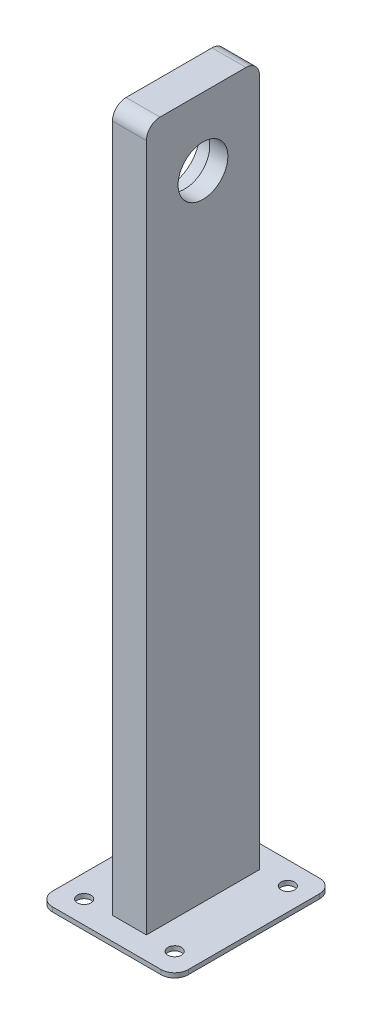
ISO-10303-21;
HEADER;
FILE_DESCRIPTION(('STEP AP214'),'2;1');
FILE_NAME('part.step','',(''),(''),'','','');
FILE_SCHEMA(('AUTOMOTIVE_DESIGN { 1 0 10303 214 1 1 1 1 }'));
ENDSEC;
DATA;
#1=APPLICATION_CONTEXT('core data for automotive mechanical design processes');
#2=APPLICATION_PROTOCOL_DEFINITION('international standard','automotive_design',2000,#1);
#3=PRODUCT_CONTEXT('',#1,'mechanical');
#4=PRODUCT('Part','Part','',(#3));
#5=PRODUCT_RELATED_PRODUCT_CATEGORY('part','',(#4));
#6=PRODUCT_DEFINITION_FORMATION('','',#4);
#7=PRODUCT_DEFINITION_CONTEXT('part definition',#1,'design');
#8=PRODUCT_DEFINITION('design','',#6,#7);
#9=PRODUCT_DEFINITION_SHAPE('','',#8);
#10=(LENGTH_UNIT() NAMED_UNIT(*) SI_UNIT(.MILLI.,.METRE.));
#11=(NAMED_UNIT(*) PLANE_ANGLE_UNIT() SI_UNIT($,.RADIAN.));
#12=(NAMED_UNIT(*) SI_UNIT($,.STERADIAN.) SOLID_ANGLE_UNIT());
#13=UNCERTAINTY_MEASURE_WITH_UNIT(LENGTH_MEASURE(1.E-05),#10,'distance_accuracy_value','');
#14=(GEOMETRIC_REPRESENTATION_CONTEXT(3) GLOBAL_UNCERTAINTY_ASSIGNED_CONTEXT((#13)) GLOBAL_UNIT_ASSIGNED_CONTEXT((#10,
#11,#12)) REPRESENTATION_CONTEXT('',''));
#15=CARTESIAN_POINT('',(0.,0.,0.));
#16=DIRECTION('',(0.,0.,1.));
#17=DIRECTION('',(1.,0.,0.));
#18=AXIS2_PLACEMENT_3D('',#15,#16,#17);
#19=CARTESIAN_POINT('',(7.5,310.,-25.));
#20=DIRECTION('',(-1.,0.,0.));
#21=DIRECTION('',(0.,0.,1.));
#22=AXIS2_PLACEMENT_3D('',#19,#20,#21);
#23=PLANE('',#22);
#24=CARTESIAN_POINT('',(7.5,280.,0.));
#25=DIRECTION('',(-1.,0.,0.));
#26=DIRECTION('',(0.,0.,1.));
#27=AXIS2_PLACEMENT_3D('',#24,#25,#26);
#28=CIRCLE('',#27,11.);
#29=CARTESIAN_POINT('',(7.50000000000001,280.,11.));
#30=VERTEX_POINT('',#29);
#31=EDGE_CURVE('E237',#30,#30,#28,.T.);
#32=ORIENTED_EDGE('',*,*,#31,.T.);
#33=EDGE_LOOP('',(#32));
#34=FACE_BOUND('',#33,.T.);
#35=DIRECTION('',(0.,-1.,0.));
#36=VECTOR('',#35,1.);
#37=CARTESIAN_POINT('',(7.5,310.,-25.));
#38=LINE('',#37,#36);
#39=CARTESIAN_POINT('',(7.5,304.,-25.));
#40=VERTEX_POINT('',#39);
#41=CARTESIAN_POINT('',(7.5,0.,-25.));
#42=VERTEX_POINT('',#41);
#43=EDGE_CURVE('E139',#40,#42,#38,.T.);
#44=ORIENTED_EDGE('',*,*,#43,.F.);
#45=CARTESIAN_POINT('',(7.5,304.,-19.));
#46=DIRECTION('',(-1.,0.,0.));
#47=DIRECTION('',(0.,0.,1.));
#48=AXIS2_PLACEMENT_3D('',#45,#46,#47);
#49=CIRCLE('',#48,6.);
#50=CARTESIAN_POINT('',(7.5,310.,-19.));
#51=VERTEX_POINT('',#50);
#52=EDGE_CURVE('E48',#40,#51,#49,.F.);
#53=ORIENTED_EDGE('',*,*,#52,.T.);
#54=DIRECTION('',(0.,0.,-1.));
#55=VECTOR('',#54,1.);
#56=CARTESIAN_POINT('',(7.5,310.,-25.));
#57=LINE('',#56,#55);
#58=CARTESIAN_POINT('',(7.50000000000001,310.,19.));
#59=VERTEX_POINT('',#58);
#60=EDGE_CURVE('E177',#59,#51,#57,.T.);
#61=ORIENTED_EDGE('',*,*,#60,.F.);
#62=CARTESIAN_POINT('',(7.50000000000001,304.,19.));
#63=DIRECTION('',(-1.,0.,0.));
#64=DIRECTION('',(0.,0.,1.));
#65=AXIS2_PLACEMENT_3D('',#62,#63,#64);
#66=CIRCLE('',#65,6.);
#67=CARTESIAN_POINT('',(7.50000000000001,304.,25.));
#68=VERTEX_POINT('',#67);
#69=EDGE_CURVE('E55',#59,#68,#66,.F.);
#70=ORIENTED_EDGE('',*,*,#69,.T.);
#71=DIRECTION('',(0.,-1.,0.));
#72=VECTOR('',#71,1.);
#73=CARTESIAN_POINT('',(7.50000000000001,310.,25.));
#74=LINE('',#73,#72);
#75=CARTESIAN_POINT('',(7.50000000000001,0.,25.));
#76=VERTEX_POINT('',#75);
#77=EDGE_CURVE('E160',#68,#76,#74,.T.);
#78=ORIENTED_EDGE('',*,*,#77,.T.);
#79=DIRECTION('',(0.,0.,-1.));
#80=VECTOR('',#79,1.);
#81=CARTESIAN_POINT('',(7.5,0.,-25.));
#82=LINE('',#81,#80);
#83=EDGE_CURVE('E154',#76,#42,#82,.T.);
#84=ORIENTED_EDGE('',*,*,#83,.T.);
#85=EDGE_LOOP('',(#44,#53,#61,#70,#78,#84));
#86=FACE_BOUND('',#85,.T.);
#87=ADVANCED_FACE('F39',(#34,#86),#23,.F.);
#88=CARTESIAN_POINT('',(-7.5,310.,-25.));
#89=DIRECTION('',(0.,0.,1.));
#90=DIRECTION('',(1.,0.,0.));
#91=AXIS2_PLACEMENT_3D('',#88,#89,#90);
#92=PLANE('',#91);
#93=DIRECTION('',(0.,-1.,0.));
#94=VECTOR('',#93,1.);
#95=CARTESIAN_POINT('',(-7.5,310.,-25.));
#96=LINE('',#95,#94);
#97=CARTESIAN_POINT('',(-7.5,304.,-25.));
#98=VERTEX_POINT('',#97);
#99=CARTESIAN_POINT('',(-7.5,0.,-25.));
#100=VERTEX_POINT('',#99);
#101=EDGE_CURVE('E147',#98,#100,#96,.T.);
#102=ORIENTED_EDGE('',*,*,#101,.F.);
#103=DIRECTION('',(-1.,0.,0.));
#104=VECTOR('',#103,1.);
#105=CARTESIAN_POINT('',(7.5,304.,-25.));
#106=LINE('',#105,#104);
#107=EDGE_CURVE('E63',#98,#40,#106,.F.);
#108=ORIENTED_EDGE('',*,*,#107,.T.);
#109=ORIENTED_EDGE('',*,*,#43,.T.);
#110=DIRECTION('',(-1.,0.,0.));
#111=VECTOR('',#110,1.);
#112=CARTESIAN_POINT('',(-7.5,0.,-25.));
#113=LINE('',#112,#111);
#114=EDGE_CURVE('E142',#42,#100,#113,.T.);
#115=ORIENTED_EDGE('',*,*,#114,.T.);
#116=EDGE_LOOP('',(#102,#108,#109,#115));
#117=FACE_BOUND('',#116,.T.);
#118=ADVANCED_FACE('F141',(#117),#92,.F.);
#119=CARTESIAN_POINT('',(-7.5,310.,-25.));
#120=DIRECTION('',(1.,0.,0.));
#121=DIRECTION('',(0.,0.,-1.));
#122=AXIS2_PLACEMENT_3D('',#119,#120,#121);
#123=PLANE('',#122);
#124=CARTESIAN_POINT('',(-7.5,280.,0.));
#125=DIRECTION('',(-1.,0.,0.));
#126=DIRECTION('',(0.,0.,1.));
#127=AXIS2_PLACEMENT_3D('',#124,#125,#126);
#128=CIRCLE('',#127,13.5);
#129=CARTESIAN_POINT('',(-7.49999999999999,280.,13.5));
#130=VERTEX_POINT('',#129);
#131=EDGE_CURVE('E241',#130,#130,#128,.T.);
#132=ORIENTED_EDGE('',*,*,#131,.F.);
#133=EDGE_LOOP('',(#132));
#134=FACE_BOUND('',#133,.T.);
#135=DIRECTION('',(0.,0.,1.));
#136=VECTOR('',#135,1.);
#137=CARTESIAN_POINT('',(-7.5,310.,-25.));
#138=LINE('',#137,#136);
#139=CARTESIAN_POINT('',(-7.5,310.,-19.));
#140=VERTEX_POINT('',#139);
#141=CARTESIAN_POINT('',(-7.5,310.,19.));
#142=VERTEX_POINT('',#141);
#143=EDGE_CURVE('E169',#140,#142,#138,.T.);
#144=ORIENTED_EDGE('',*,*,#143,.F.);
#145=CARTESIAN_POINT('',(-7.5,304.,-19.));
#146=DIRECTION('',(1.,0.,0.));
#147=DIRECTION('',(0.,0.,-1.));
#148=AXIS2_PLACEMENT_3D('',#145,#146,#147);
#149=CIRCLE('',#148,6.);
#150=EDGE_CURVE('E253',#140,#98,#149,.F.);
#151=ORIENTED_EDGE('',*,*,#150,.T.);
#152=ORIENTED_EDGE('',*,*,#101,.T.);
#153=DIRECTION('',(0.,0.,1.));
#154=VECTOR('',#153,1.);
#155=CARTESIAN_POINT('',(-7.5,0.,-25.));
#156=LINE('',#155,#154);
#157=CARTESIAN_POINT('',(-7.49999999999999,0.,25.));
#158=VERTEX_POINT('',#157);
#159=EDGE_CURVE('E157',#100,#158,#156,.T.);
#160=ORIENTED_EDGE('',*,*,#159,.T.);
#161=DIRECTION('',(0.,-1.,0.));
#162=VECTOR('',#161,1.);
#163=CARTESIAN_POINT('',(-7.49999999999999,310.,25.));
#164=LINE('',#163,#162);
#165=CARTESIAN_POINT('',(-7.49999999999999,304.,25.));
#166=VERTEX_POINT('',#165);
#167=EDGE_CURVE('E180',#166,#158,#164,.T.);
#168=ORIENTED_EDGE('',*,*,#167,.F.);
#169=CARTESIAN_POINT('',(-7.5,304.,19.));
#170=DIRECTION('',(1.,0.,0.));
#171=DIRECTION('',(0.,0.,-1.));
#172=AXIS2_PLACEMENT_3D('',#169,#170,#171);
#173=CIRCLE('',#172,6.);
#174=EDGE_CURVE('E250',#166,#142,#173,.F.);
#175=ORIENTED_EDGE('',*,*,#174,.T.);
#176=EDGE_LOOP('',(#144,#151,#152,#160,#168,#175));
#177=FACE_BOUND('',#176,.T.);
#178=ADVANCED_FACE('F271',(#134,#177),#123,.F.);
#179=CARTESIAN_POINT('',(-7.49999999999999,310.,25.));
#180=DIRECTION('',(0.,0.,-1.));
#181=DIRECTION('',(-1.,0.,0.));
#182=AXIS2_PLACEMENT_3D('',#179,#180,#181);
#183=PLANE('',#182);
#184=ORIENTED_EDGE('',*,*,#77,.F.);
#185=DIRECTION('',(1.,0.,0.));
#186=VECTOR('',#185,1.);
#187=CARTESIAN_POINT('',(-7.49999999999999,304.,25.));
#188=LINE('',#187,#186);
#189=EDGE_CURVE('E11',#68,#166,#188,.F.);
#190=ORIENTED_EDGE('',*,*,#189,.T.);
#191=ORIENTED_EDGE('',*,*,#167,.T.);
#192=DIRECTION('',(1.,0.,0.));
#193=VECTOR('',#192,1.);
#194=CARTESIAN_POINT('',(-7.49999999999999,0.,25.));
#195=LINE('',#194,#193);
#196=EDGE_CURVE('E174',#158,#76,#195,.T.);
#197=ORIENTED_EDGE('',*,*,#196,.T.);
#198=EDGE_LOOP('',(#184,#190,#191,#197));
#199=FACE_BOUND('',#198,.T.);
#200=ADVANCED_FACE('F278',(#199),#183,.F.);
#201=CARTESIAN_POINT('',(0.,310.,0.));
#202=DIRECTION('',(0.,1.,0.));
#203=DIRECTION('',(0.,0.,1.));
#204=AXIS2_PLACEMENT_3D('',#201,#202,#203);
#205=PLANE('',#204);
#206=ORIENTED_EDGE('',*,*,#60,.T.);
#207=DIRECTION('',(-1.,0.,0.));
#208=VECTOR('',#207,1.);
#209=CARTESIAN_POINT('',(-7.5,310.,-19.));
#210=LINE('',#209,#208);
#211=EDGE_CURVE('E246',#51,#140,#210,.T.);
#212=ORIENTED_EDGE('',*,*,#211,.T.);
#213=ORIENTED_EDGE('',*,*,#143,.T.);
#214=DIRECTION('',(1.,0.,0.));
#215=VECTOR('',#214,1.);
#216=CARTESIAN_POINT('',(7.50000000000001,310.,19.));
#217=LINE('',#216,#215);
#218=EDGE_CURVE('E236',#142,#59,#217,.T.);
#219=ORIENTED_EDGE('',*,*,#218,.T.);
#220=EDGE_LOOP('',(#206,#212,#213,#219));
#221=FACE_BOUND('',#220,.T.);
#222=ADVANCED_FACE('F264',(#221),#205,.T.);
#223=CARTESIAN_POINT('',(0.,0.,0.));
#224=DIRECTION('',(0.,1.,0.));
#225=DIRECTION('',(0.,0.,1.));
#226=AXIS2_PLACEMENT_3D('',#223,#224,#225);
#227=PLANE('',#226);
#228=CARTESIAN_POINT('',(20.,0.,-25.));
#229=DIRECTION('',(0.,1.,0.));
#230=DIRECTION('',(0.,0.,-1.));
#231=AXIS2_PLACEMENT_3D('',#228,#229,#230);
#232=CIRCLE('',#231,3.);
#233=CARTESIAN_POINT('',(20.,0.,-28.));
#234=VERTEX_POINT('',#233);
#235=EDGE_CURVE('E449',#234,#234,#232,.T.);
#236=ORIENTED_EDGE('',*,*,#235,.F.);
#237=EDGE_LOOP('',(#236));
#238=FACE_BOUND('',#237,.T.);
#239=CARTESIAN_POINT('',(-20.,0.,-25.));
#240=DIRECTION('',(0.,1.,0.));
#241=DIRECTION('',(0.,0.,1.));
#242=AXIS2_PLACEMENT_3D('',#239,#240,#241);
#243=CIRCLE('',#242,3.);
#244=CARTESIAN_POINT('',(-20.,0.,-22.));
#245=VERTEX_POINT('',#244);
#246=EDGE_CURVE('E441',#245,#245,#243,.T.);
#247=ORIENTED_EDGE('',*,*,#246,.F.);
#248=EDGE_LOOP('',(#247));
#249=FACE_BOUND('',#248,.T.);
#250=CARTESIAN_POINT('',(-20.,0.,25.));
#251=DIRECTION('',(0.,1.,0.));
#252=DIRECTION('',(0.,0.,-1.));
#253=AXIS2_PLACEMENT_3D('',#250,#251,#252);
#254=CIRCLE('',#253,3.);
#255=CARTESIAN_POINT('',(-20.,0.,22.));
#256=VERTEX_POINT('',#255);
#257=EDGE_CURVE('E433',#256,#256,#254,.T.);
#258=ORIENTED_EDGE('',*,*,#257,.F.);
#259=EDGE_LOOP('',(#258));
#260=FACE_BOUND('',#259,.T.);
#261=CARTESIAN_POINT('',(20.,0.,25.));
#262=DIRECTION('',(0.,1.,0.));
#263=DIRECTION('',(0.,0.,1.));
#264=AXIS2_PLACEMENT_3D('',#261,#262,#263);
#265=CIRCLE('',#264,3.);
#266=CARTESIAN_POINT('',(20.,0.,28.));
#267=VERTEX_POINT('',#266);
#268=EDGE_CURVE('E426',#267,#267,#265,.T.);
#269=ORIENTED_EDGE('',*,*,#268,.F.);
#270=EDGE_LOOP('',(#269));
#271=FACE_BOUND('',#270,.T.);
#272=DIRECTION('',(0.,0.,1.));
#273=VECTOR('',#272,1.);
#274=CARTESIAN_POINT('',(30.,0.,35.));
#275=LINE('',#274,#273);
#276=CARTESIAN_POINT('',(30.,0.,-29.));
#277=VERTEX_POINT('',#276);
#278=CARTESIAN_POINT('',(30.,0.,29.));
#279=VERTEX_POINT('',#278);
#280=EDGE_CURVE('E407',#277,#279,#275,.T.);
#281=ORIENTED_EDGE('',*,*,#280,.F.);
#282=CARTESIAN_POINT('',(24.,0.,-29.));
#283=DIRECTION('',(0.,1.,0.));
#284=DIRECTION('',(0.,0.,1.));
#285=AXIS2_PLACEMENT_3D('',#282,#283,#284);
#286=CIRCLE('',#285,6.);
#287=CARTESIAN_POINT('',(24.,0.,-35.));
#288=VERTEX_POINT('',#287);
#289=EDGE_CURVE('E200',#277,#288,#286,.T.);
#290=ORIENTED_EDGE('',*,*,#289,.T.);
#291=DIRECTION('',(1.,0.,0.));
#292=VECTOR('',#291,1.);
#293=CARTESIAN_POINT('',(30.,0.,-35.));
#294=LINE('',#293,#292);
#295=CARTESIAN_POINT('',(-24.,0.,-35.));
#296=VERTEX_POINT('',#295);
#297=EDGE_CURVE('E381',#296,#288,#294,.T.);
#298=ORIENTED_EDGE('',*,*,#297,.F.);
#299=CARTESIAN_POINT('',(-24.,0.,-29.));
#300=DIRECTION('',(0.,1.,0.));
#301=DIRECTION('',(0.,0.,1.));
#302=AXIS2_PLACEMENT_3D('',#299,#300,#301);
#303=CIRCLE('',#302,6.);
#304=CARTESIAN_POINT('',(-30.,0.,-29.));
#305=VERTEX_POINT('',#304);
#306=EDGE_CURVE('E194',#296,#305,#303,.T.);
#307=ORIENTED_EDGE('',*,*,#306,.T.);
#308=DIRECTION('',(0.,0.,-1.));
#309=VECTOR('',#308,1.);
#310=CARTESIAN_POINT('',(-30.,0.,35.));
#311=LINE('',#310,#309);
#312=CARTESIAN_POINT('',(-30.,0.,29.));
#313=VERTEX_POINT('',#312);
#314=EDGE_CURVE('E374',#313,#305,#311,.T.);
#315=ORIENTED_EDGE('',*,*,#314,.F.);
#316=CARTESIAN_POINT('',(-24.,0.,29.));
#317=DIRECTION('',(0.,1.,0.));
#318=DIRECTION('',(0.,0.,1.));
#319=AXIS2_PLACEMENT_3D('',#316,#317,#318);
#320=CIRCLE('',#319,6.);
#321=CARTESIAN_POINT('',(-24.,0.,35.));
#322=VERTEX_POINT('',#321);
#323=EDGE_CURVE('E191',#313,#322,#320,.T.);
#324=ORIENTED_EDGE('',*,*,#323,.T.);
#325=DIRECTION('',(-1.,0.,0.));
#326=VECTOR('',#325,1.);
#327=CARTESIAN_POINT('',(30.,0.,35.));
#328=LINE('',#327,#326);
#329=CARTESIAN_POINT('',(24.,0.,35.));
#330=VERTEX_POINT('',#329);
#331=EDGE_CURVE('E401',#330,#322,#328,.T.);
#332=ORIENTED_EDGE('',*,*,#331,.F.);
#333=CARTESIAN_POINT('',(24.,0.,29.));
#334=DIRECTION('',(0.,1.,0.));
#335=DIRECTION('',(0.,0.,1.));
#336=AXIS2_PLACEMENT_3D('',#333,#334,#335);
#337=CIRCLE('',#336,6.);
#338=EDGE_CURVE('E197',#330,#279,#337,.T.);
#339=ORIENTED_EDGE('',*,*,#338,.T.);
#340=EDGE_LOOP('',(#281,#290,#298,#307,#315,#324,#332,#339));
#341=FACE_BOUND('',#340,.T.);
#342=ORIENTED_EDGE('',*,*,#83,.F.);
#343=ORIENTED_EDGE('',*,*,#196,.F.);
#344=ORIENTED_EDGE('',*,*,#159,.F.);
#345=ORIENTED_EDGE('',*,*,#114,.F.);
#346=EDGE_LOOP('',(#342,#343,#344,#345));
#347=FACE_BOUND('',#346,.T.);
#348=ADVANCED_FACE('F152',(#238,#249,#260,#271,#341,#347),#227,.T.);
#349=CARTESIAN_POINT('',(-30.,-2.,35.));
#350=DIRECTION('',(1.,0.,0.));
#351=DIRECTION('',(0.,0.,-1.));
#352=AXIS2_PLACEMENT_3D('',#349,#350,#351);
#353=PLANE('',#352);
#354=ORIENTED_EDGE('',*,*,#314,.T.);
#355=DIRECTION('',(0.,1.,0.));
#356=VECTOR('',#355,1.);
#357=CARTESIAN_POINT('',(-30.,-2.,-29.));
#358=LINE('',#357,#356);
#359=CARTESIAN_POINT('',(-30.,-2.,-29.));
#360=VERTEX_POINT('',#359);
#361=EDGE_CURVE('E233',#305,#360,#358,.F.);
#362=ORIENTED_EDGE('',*,*,#361,.T.);
#363=DIRECTION('',(0.,0.,-1.));
#364=VECTOR('',#363,1.);
#365=CARTESIAN_POINT('',(-30.,-2.,35.));
#366=LINE('',#365,#364);
#367=CARTESIAN_POINT('',(-30.,-2.,29.));
#368=VERTEX_POINT('',#367);
#369=EDGE_CURVE('E391',#368,#360,#366,.T.);
#370=ORIENTED_EDGE('',*,*,#369,.F.);
#371=DIRECTION('',(0.,1.,0.));
#372=VECTOR('',#371,1.);
#373=CARTESIAN_POINT('',(-30.,-2.,29.));
#374=LINE('',#373,#372);
#375=EDGE_CURVE('E229',#368,#313,#374,.T.);
#376=ORIENTED_EDGE('',*,*,#375,.T.);
#377=EDGE_LOOP('',(#354,#362,#370,#376));
#378=FACE_BOUND('',#377,.T.);
#379=ADVANCED_FACE('F355',(#378),#353,.F.);
#380=CARTESIAN_POINT('',(30.,-2.,-35.));
#381=DIRECTION('',(0.,0.,1.));
#382=DIRECTION('',(1.,0.,0.));
#383=AXIS2_PLACEMENT_3D('',#380,#381,#382);
#384=PLANE('',#383);
#385=ORIENTED_EDGE('',*,*,#297,.T.);
#386=DIRECTION('',(0.,1.,0.));
#387=VECTOR('',#386,1.);
#388=CARTESIAN_POINT('',(24.,-2.,-35.));
#389=LINE('',#388,#387);
#390=CARTESIAN_POINT('',(24.,-2.,-35.));
#391=VERTEX_POINT('',#390);
#392=EDGE_CURVE('E207',#288,#391,#389,.F.);
#393=ORIENTED_EDGE('',*,*,#392,.T.);
#394=DIRECTION('',(1.,0.,0.));
#395=VECTOR('',#394,1.);
#396=CARTESIAN_POINT('',(30.,-2.,-35.));
#397=LINE('',#396,#395);
#398=CARTESIAN_POINT('',(-24.,-2.,-35.));
#399=VERTEX_POINT('',#398);
#400=EDGE_CURVE('E389',#399,#391,#397,.T.);
#401=ORIENTED_EDGE('',*,*,#400,.F.);
#402=DIRECTION('',(0.,1.,0.));
#403=VECTOR('',#402,1.);
#404=CARTESIAN_POINT('',(-24.,-2.,-35.));
#405=LINE('',#404,#403);
#406=EDGE_CURVE('E203',#399,#296,#405,.T.);
#407=ORIENTED_EDGE('',*,*,#406,.T.);
#408=EDGE_LOOP('',(#385,#393,#401,#407));
#409=FACE_BOUND('',#408,.T.);
#410=ADVANCED_FACE('F363',(#409),#384,.F.);
#411=CARTESIAN_POINT('',(30.,-2.,35.));
#412=DIRECTION('',(-1.,0.,0.));
#413=DIRECTION('',(0.,0.,1.));
#414=AXIS2_PLACEMENT_3D('',#411,#412,#413);
#415=PLANE('',#414);
#416=DIRECTION('',(0.,0.,1.));
#417=VECTOR('',#416,1.);
#418=CARTESIAN_POINT('',(30.,-2.,35.));
#419=LINE('',#418,#417);
#420=CARTESIAN_POINT('',(30.,-2.,-29.));
#421=VERTEX_POINT('',#420);
#422=CARTESIAN_POINT('',(30.,-2.,29.));
#423=VERTEX_POINT('',#422);
#424=EDGE_CURVE('E166',#421,#423,#419,.T.);
#425=ORIENTED_EDGE('',*,*,#424,.F.);
#426=DIRECTION('',(0.,1.,0.));
#427=VECTOR('',#426,1.);
#428=CARTESIAN_POINT('',(30.,-2.,-29.));
#429=LINE('',#428,#427);
#430=EDGE_CURVE('E187',#421,#277,#429,.T.);
#431=ORIENTED_EDGE('',*,*,#430,.T.);
#432=ORIENTED_EDGE('',*,*,#280,.T.);
#433=DIRECTION('',(0.,1.,0.));
#434=VECTOR('',#433,1.);
#435=CARTESIAN_POINT('',(30.,-2.,29.));
#436=LINE('',#435,#434);
#437=EDGE_CURVE('E146',#279,#423,#436,.F.);
#438=ORIENTED_EDGE('',*,*,#437,.T.);
#439=EDGE_LOOP('',(#425,#431,#432,#438));
#440=FACE_BOUND('',#439,.T.);
#441=ADVANCED_FACE('F359',(#440),#415,.F.);
#442=CARTESIAN_POINT('',(30.,-2.,35.));
#443=DIRECTION('',(0.,0.,-1.));
#444=DIRECTION('',(-1.,0.,0.));
#445=AXIS2_PLACEMENT_3D('',#442,#443,#444);
#446=PLANE('',#445);
#447=DIRECTION('',(-1.,0.,0.));
#448=VECTOR('',#447,1.);
#449=CARTESIAN_POINT('',(30.,-2.,35.));
#450=LINE('',#449,#448);
#451=CARTESIAN_POINT('',(24.,-2.,35.));
#452=VERTEX_POINT('',#451);
#453=CARTESIAN_POINT('',(-24.,-2.,35.));
#454=VERTEX_POINT('',#453);
#455=EDGE_CURVE('E162',#452,#454,#450,.T.);
#456=ORIENTED_EDGE('',*,*,#455,.F.);
#457=DIRECTION('',(0.,1.,0.));
#458=VECTOR('',#457,1.);
#459=CARTESIAN_POINT('',(24.,-2.,35.));
#460=LINE('',#459,#458);
#461=EDGE_CURVE('E225',#452,#330,#460,.T.);
#462=ORIENTED_EDGE('',*,*,#461,.T.);
#463=ORIENTED_EDGE('',*,*,#331,.T.);
#464=DIRECTION('',(0.,1.,0.));
#465=VECTOR('',#464,1.);
#466=CARTESIAN_POINT('',(-24.,-2.,35.));
#467=LINE('',#466,#465);
#468=EDGE_CURVE('E222',#322,#454,#467,.F.);
#469=ORIENTED_EDGE('',*,*,#468,.T.);
#470=EDGE_LOOP('',(#456,#462,#463,#469));
#471=FACE_BOUND('',#470,.T.);
#472=ADVANCED_FACE('F351',(#471),#446,.F.);
#473=CARTESIAN_POINT('',(0.,-2.,0.));
#474=DIRECTION('',(0.,1.,0.));
#475=DIRECTION('',(0.,0.,1.));
#476=AXIS2_PLACEMENT_3D('',#473,#474,#475);
#477=PLANE('',#476);
#478=CARTESIAN_POINT('',(20.,-2.,-25.));
#479=DIRECTION('',(0.,1.,0.));
#480=DIRECTION('',(0.,0.,-1.));
#481=AXIS2_PLACEMENT_3D('',#478,#479,#480);
#482=CIRCLE('',#481,3.);
#483=CARTESIAN_POINT('',(20.,-2.,-28.));
#484=VERTEX_POINT('',#483);
#485=EDGE_CURVE('E445',#484,#484,#482,.T.);
#486=ORIENTED_EDGE('',*,*,#485,.T.);
#487=EDGE_LOOP('',(#486));
#488=FACE_BOUND('',#487,.T.);
#489=CARTESIAN_POINT('',(-20.,-2.,-25.));
#490=DIRECTION('',(0.,1.,0.));
#491=DIRECTION('',(0.,0.,1.));
#492=AXIS2_PLACEMENT_3D('',#489,#490,#491);
#493=CIRCLE('',#492,3.);
#494=CARTESIAN_POINT('',(-20.,-2.,-22.));
#495=VERTEX_POINT('',#494);
#496=EDGE_CURVE('E437',#495,#495,#493,.T.);
#497=ORIENTED_EDGE('',*,*,#496,.T.);
#498=EDGE_LOOP('',(#497));
#499=FACE_BOUND('',#498,.T.);
#500=CARTESIAN_POINT('',(-20.,-2.,25.));
#501=DIRECTION('',(0.,1.,0.));
#502=DIRECTION('',(0.,0.,-1.));
#503=AXIS2_PLACEMENT_3D('',#500,#501,#502);
#504=CIRCLE('',#503,3.);
#505=CARTESIAN_POINT('',(-20.,-2.,22.));
#506=VERTEX_POINT('',#505);
#507=EDGE_CURVE('E430',#506,#506,#504,.T.);
#508=ORIENTED_EDGE('',*,*,#507,.T.);
#509=EDGE_LOOP('',(#508));
#510=FACE_BOUND('',#509,.T.);
#511=CARTESIAN_POINT('',(20.,-2.,25.));
#512=DIRECTION('',(0.,1.,0.));
#513=DIRECTION('',(0.,0.,1.));
#514=AXIS2_PLACEMENT_3D('',#511,#512,#513);
#515=CIRCLE('',#514,3.);
#516=CARTESIAN_POINT('',(20.,-2.,28.));
#517=VERTEX_POINT('',#516);
#518=EDGE_CURVE('E382',#517,#517,#515,.T.);
#519=ORIENTED_EDGE('',*,*,#518,.T.);
#520=EDGE_LOOP('',(#519));
#521=FACE_BOUND('',#520,.T.);
#522=ORIENTED_EDGE('',*,*,#400,.T.);
#523=CARTESIAN_POINT('',(24.,-2.,-29.));
#524=DIRECTION('',(0.,1.,0.));
#525=DIRECTION('',(0.,0.,1.));
#526=AXIS2_PLACEMENT_3D('',#523,#524,#525);
#527=CIRCLE('',#526,6.);
#528=EDGE_CURVE('E219',#391,#421,#527,.F.);
#529=ORIENTED_EDGE('',*,*,#528,.T.);
#530=ORIENTED_EDGE('',*,*,#424,.T.);
#531=CARTESIAN_POINT('',(24.,-2.,29.));
#532=DIRECTION('',(0.,1.,0.));
#533=DIRECTION('',(0.,0.,1.));
#534=AXIS2_PLACEMENT_3D('',#531,#532,#533);
#535=CIRCLE('',#534,6.);
#536=EDGE_CURVE('E216',#423,#452,#535,.F.);
#537=ORIENTED_EDGE('',*,*,#536,.T.);
#538=ORIENTED_EDGE('',*,*,#455,.T.);
#539=CARTESIAN_POINT('',(-24.,-2.,29.));
#540=DIRECTION('',(0.,1.,0.));
#541=DIRECTION('',(0.,0.,1.));
#542=AXIS2_PLACEMENT_3D('',#539,#540,#541);
#543=CIRCLE('',#542,6.);
#544=EDGE_CURVE('E210',#454,#368,#543,.F.);
#545=ORIENTED_EDGE('',*,*,#544,.T.);
#546=ORIENTED_EDGE('',*,*,#369,.T.);
#547=CARTESIAN_POINT('',(-24.,-2.,-29.));
#548=DIRECTION('',(0.,1.,0.));
#549=DIRECTION('',(0.,0.,1.));
#550=AXIS2_PLACEMENT_3D('',#547,#548,#549);
#551=CIRCLE('',#550,6.);
#552=EDGE_CURVE('E213',#360,#399,#551,.F.);
#553=ORIENTED_EDGE('',*,*,#552,.T.);
#554=EDGE_LOOP('',(#522,#529,#530,#537,#538,#545,#546,#553));
#555=FACE_BOUND('',#554,.T.);
#556=ADVANCED_FACE('F347',(#488,#499,#510,#521,#555),#477,.F.);
#557=CARTESIAN_POINT('',(20.,-2.,25.));
#558=DIRECTION('',(0.,1.,0.));
#559=DIRECTION('',(0.,0.,1.));
#560=AXIS2_PLACEMENT_3D('',#557,#558,#559);
#561=CYLINDRICAL_SURFACE('',#560,3.);
#562=ORIENTED_EDGE('',*,*,#518,.F.);
#563=EDGE_LOOP('',(#562));
#564=FACE_BOUND('',#563,.T.);
#565=ORIENTED_EDGE('',*,*,#268,.T.);
#566=EDGE_LOOP('',(#565));
#567=FACE_BOUND('',#566,.T.);
#568=ADVANCED_FACE('F337',(#564,#567),#561,.F.);
#569=CARTESIAN_POINT('',(-20.,-2.,25.));
#570=DIRECTION('',(0.,1.,0.));
#571=DIRECTION('',(0.,0.,1.));
#572=AXIS2_PLACEMENT_3D('',#569,#570,#571);
#573=CYLINDRICAL_SURFACE('',#572,3.);
#574=ORIENTED_EDGE('',*,*,#507,.F.);
#575=EDGE_LOOP('',(#574));
#576=FACE_BOUND('',#575,.T.);
#577=ORIENTED_EDGE('',*,*,#257,.T.);
#578=EDGE_LOOP('',(#577));
#579=FACE_BOUND('',#578,.T.);
#580=ADVANCED_FACE('F333',(#576,#579),#573,.F.);
#581=CARTESIAN_POINT('',(-20.,-2.,-25.));
#582=DIRECTION('',(0.,1.,0.));
#583=DIRECTION('',(0.,0.,1.));
#584=AXIS2_PLACEMENT_3D('',#581,#582,#583);
#585=CYLINDRICAL_SURFACE('',#584,3.);
#586=ORIENTED_EDGE('',*,*,#496,.F.);
#587=EDGE_LOOP('',(#586));
#588=FACE_BOUND('',#587,.T.);
#589=ORIENTED_EDGE('',*,*,#246,.T.);
#590=EDGE_LOOP('',(#589));
#591=FACE_BOUND('',#590,.T.);
#592=ADVANCED_FACE('F336',(#588,#591),#585,.F.);
#593=CARTESIAN_POINT('',(20.,-2.,-25.));
#594=DIRECTION('',(0.,1.,0.));
#595=DIRECTION('',(0.,0.,1.));
#596=AXIS2_PLACEMENT_3D('',#593,#594,#595);
#597=CYLINDRICAL_SURFACE('',#596,3.);
#598=ORIENTED_EDGE('',*,*,#485,.F.);
#599=EDGE_LOOP('',(#598));
#600=FACE_BOUND('',#599,.T.);
#601=ORIENTED_EDGE('',*,*,#235,.T.);
#602=EDGE_LOOP('',(#601));
#603=FACE_BOUND('',#602,.T.);
#604=ADVANCED_FACE('F300',(#600,#603),#597,.F.);
#605=CARTESIAN_POINT('',(24.,-2.,-29.));
#606=DIRECTION('',(0.,1.,0.));
#607=DIRECTION('',(0.,0.,1.));
#608=AXIS2_PLACEMENT_3D('',#605,#606,#607);
#609=CYLINDRICAL_SURFACE('',#608,6.);
#610=ORIENTED_EDGE('',*,*,#528,.F.);
#611=ORIENTED_EDGE('',*,*,#392,.F.);
#612=ORIENTED_EDGE('',*,*,#289,.F.);
#613=ORIENTED_EDGE('',*,*,#430,.F.);
#614=EDGE_LOOP('',(#610,#611,#612,#613));
#615=FACE_BOUND('',#614,.T.);
#616=ADVANCED_FACE('F296',(#615),#609,.T.);
#617=CARTESIAN_POINT('',(24.,-2.,29.));
#618=DIRECTION('',(0.,1.,0.));
#619=DIRECTION('',(0.,0.,1.));
#620=AXIS2_PLACEMENT_3D('',#617,#618,#619);
#621=CYLINDRICAL_SURFACE('',#620,6.);
#622=ORIENTED_EDGE('',*,*,#536,.F.);
#623=ORIENTED_EDGE('',*,*,#437,.F.);
#624=ORIENTED_EDGE('',*,*,#338,.F.);
#625=ORIENTED_EDGE('',*,*,#461,.F.);
#626=EDGE_LOOP('',(#622,#623,#624,#625));
#627=FACE_BOUND('',#626,.T.);
#628=ADVANCED_FACE('F299',(#627),#621,.T.);
#629=CARTESIAN_POINT('',(-24.,-2.,-29.));
#630=DIRECTION('',(0.,1.,0.));
#631=DIRECTION('',(0.,0.,1.));
#632=AXIS2_PLACEMENT_3D('',#629,#630,#631);
#633=CYLINDRICAL_SURFACE('',#632,6.);
#634=ORIENTED_EDGE('',*,*,#552,.F.);
#635=ORIENTED_EDGE('',*,*,#361,.F.);
#636=ORIENTED_EDGE('',*,*,#306,.F.);
#637=ORIENTED_EDGE('',*,*,#406,.F.);
#638=EDGE_LOOP('',(#634,#635,#636,#637));
#639=FACE_BOUND('',#638,.T.);
#640=ADVANCED_FACE('F304',(#639),#633,.T.);
#641=CARTESIAN_POINT('',(-24.,-2.,29.));
#642=DIRECTION('',(0.,1.,0.));
#643=DIRECTION('',(0.,0.,1.));
#644=AXIS2_PLACEMENT_3D('',#641,#642,#643);
#645=CYLINDRICAL_SURFACE('',#644,6.);
#646=ORIENTED_EDGE('',*,*,#544,.F.);
#647=ORIENTED_EDGE('',*,*,#468,.F.);
#648=ORIENTED_EDGE('',*,*,#323,.F.);
#649=ORIENTED_EDGE('',*,*,#375,.F.);
#650=EDGE_LOOP('',(#646,#647,#648,#649));
#651=FACE_BOUND('',#650,.T.);
#652=ADVANCED_FACE('F308',(#651),#645,.T.);
#653=CARTESIAN_POINT('',(-0.499999999999996,280.,0.));
#654=DIRECTION('',(-1.,0.,0.));
#655=DIRECTION('',(0.,0.,1.));
#656=AXIS2_PLACEMENT_3D('',#653,#654,#655);
#657=CYLINDRICAL_SURFACE('',#656,13.5);
#658=CARTESIAN_POINT('',(-0.499999999999996,280.,0.));
#659=DIRECTION('',(-1.,0.,0.));
#660=DIRECTION('',(0.,0.,1.));
#661=AXIS2_PLACEMENT_3D('',#658,#659,#660);
#662=CIRCLE('',#661,13.5);
#663=CARTESIAN_POINT('',(-0.499999999999995,280.,13.5));
#664=VERTEX_POINT('',#663);
#665=EDGE_CURVE('E453',#664,#664,#662,.T.);
#666=ORIENTED_EDGE('',*,*,#665,.F.);
#667=EDGE_LOOP('',(#666));
#668=FACE_BOUND('',#667,.T.);
#669=ORIENTED_EDGE('',*,*,#131,.T.);
#670=EDGE_LOOP('',(#669));
#671=FACE_BOUND('',#670,.T.);
#672=ADVANCED_FACE('F311',(#668,#671),#657,.F.);
#673=CARTESIAN_POINT('',(-0.499999999999996,280.,0.));
#674=DIRECTION('',(-1.,0.,0.));
#675=DIRECTION('',(0.,0.,1.));
#676=AXIS2_PLACEMENT_3D('',#673,#674,#675);
#677=PLANE('',#676);
#678=CARTESIAN_POINT('',(-0.499999999999996,280.,0.));
#679=DIRECTION('',(-1.,0.,0.));
#680=DIRECTION('',(0.,0.,1.));
#681=AXIS2_PLACEMENT_3D('',#678,#679,#680);
#682=CIRCLE('',#681,11.);
#683=CARTESIAN_POINT('',(-0.499999999999995,280.,11.));
#684=VERTEX_POINT('',#683);
#685=EDGE_CURVE('E242',#684,#684,#682,.T.);
#686=ORIENTED_EDGE('',*,*,#685,.F.);
#687=EDGE_LOOP('',(#686));
#688=FACE_BOUND('',#687,.T.);
#689=ORIENTED_EDGE('',*,*,#665,.T.);
#690=EDGE_LOOP('',(#689));
#691=FACE_BOUND('',#690,.T.);
#692=ADVANCED_FACE('F319',(#688,#691),#677,.T.);
#693=CARTESIAN_POINT('',(30.,280.,0.));
#694=DIRECTION('',(-1.,0.,0.));
#695=DIRECTION('',(0.,0.,1.));
#696=AXIS2_PLACEMENT_3D('',#693,#694,#695);
#697=CYLINDRICAL_SURFACE('',#696,11.);
#698=ORIENTED_EDGE('',*,*,#685,.T.);
#699=EDGE_LOOP('',(#698));
#700=FACE_BOUND('',#699,.T.);
#701=ORIENTED_EDGE('',*,*,#31,.F.);
#702=EDGE_LOOP('',(#701));
#703=FACE_BOUND('',#702,.T.);
#704=ADVANCED_FACE('F314',(#700,#703),#697,.F.);
#705=CARTESIAN_POINT('',(0.,304.,-19.));
#706=DIRECTION('',(1.,0.,0.));
#707=DIRECTION('',(0.,0.,-1.));
#708=AXIS2_PLACEMENT_3D('',#705,#706,#707);
#709=CYLINDRICAL_SURFACE('',#708,6.);
#710=ORIENTED_EDGE('',*,*,#52,.F.);
#711=ORIENTED_EDGE('',*,*,#107,.F.);
#712=ORIENTED_EDGE('',*,*,#150,.F.);
#713=ORIENTED_EDGE('',*,*,#211,.F.);
#714=EDGE_LOOP('',(#710,#711,#712,#713));
#715=FACE_BOUND('',#714,.T.);
#716=ADVANCED_FACE('F269',(#715),#709,.T.);
#717=CARTESIAN_POINT('',(0.,304.,19.));
#718=DIRECTION('',(-1.,0.,0.));
#719=DIRECTION('',(0.,0.,1.));
#720=AXIS2_PLACEMENT_3D('',#717,#718,#719);
#721=CYLINDRICAL_SURFACE('',#720,6.);
#722=ORIENTED_EDGE('',*,*,#174,.F.);
#723=ORIENTED_EDGE('',*,*,#189,.F.);
#724=ORIENTED_EDGE('',*,*,#69,.F.);
#725=ORIENTED_EDGE('',*,*,#218,.F.);
#726=EDGE_LOOP('',(#722,#723,#724,#725));
#727=FACE_BOUND('',#726,.T.);
#728=ADVANCED_FACE('F41',(#727),#721,.T.);
#729=CLOSED_SHELL('',(#87,#118,#178,#200,#222,#348,#379,#410,#441,#472,#556,#568,#580,#592,#604,
#616,#628,#640,#652,#672,#692,#704,#716,#728));
#730=MANIFOLD_SOLID_BREP('B2',#729);
#731=ADVANCED_BREP_SHAPE_REPRESENTATION('',(#18,#730),#14);
#732=SHAPE_DEFINITION_REPRESENTATION(#9,#731);
ENDSEC;
END-ISO-10303-21;
